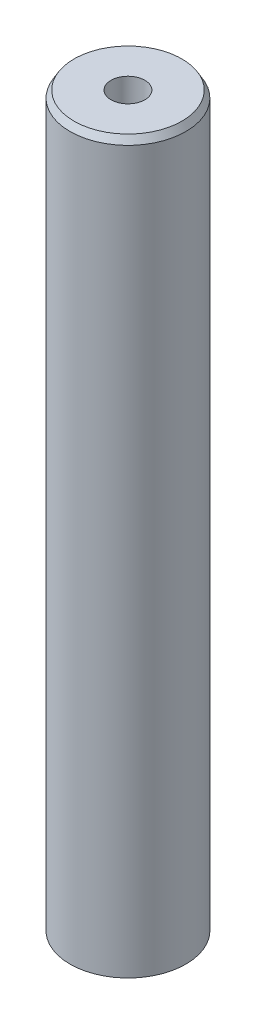
ISO-10303-21;
HEADER;
FILE_DESCRIPTION(('STEP AP214'),'2;1');
FILE_NAME('part.step','',(''),(''),'','','');
FILE_SCHEMA(('AUTOMOTIVE_DESIGN { 1 0 10303 214 1 1 1 1 }'));
ENDSEC;
DATA;
#1=APPLICATION_CONTEXT('core data for automotive mechanical design processes');
#2=APPLICATION_PROTOCOL_DEFINITION('international standard','automotive_design',2000,#1);
#3=PRODUCT_CONTEXT('',#1,'mechanical');
#4=PRODUCT('Part','Part','',(#3));
#5=PRODUCT_RELATED_PRODUCT_CATEGORY('part','',(#4));
#6=PRODUCT_DEFINITION_FORMATION('','',#4);
#7=PRODUCT_DEFINITION_CONTEXT('part definition',#1,'design');
#8=PRODUCT_DEFINITION('design','',#6,#7);
#9=PRODUCT_DEFINITION_SHAPE('','',#8);
#10=(LENGTH_UNIT() NAMED_UNIT(*) SI_UNIT(.MILLI.,.METRE.));
#11=(NAMED_UNIT(*) PLANE_ANGLE_UNIT() SI_UNIT($,.RADIAN.));
#12=(NAMED_UNIT(*) SI_UNIT($,.STERADIAN.) SOLID_ANGLE_UNIT());
#13=UNCERTAINTY_MEASURE_WITH_UNIT(LENGTH_MEASURE(1.E-05),#10,'distance_accuracy_value','');
#14=(GEOMETRIC_REPRESENTATION_CONTEXT(3) GLOBAL_UNCERTAINTY_ASSIGNED_CONTEXT((#13)) GLOBAL_UNIT_ASSIGNED_CONTEXT((#10,
#11,#12)) REPRESENTATION_CONTEXT('',''));
#15=CARTESIAN_POINT('',(0.,0.,0.));
#16=DIRECTION('',(0.,0.,1.));
#17=DIRECTION('',(1.,0.,0.));
#18=AXIS2_PLACEMENT_3D('',#15,#16,#17);
#19=CARTESIAN_POINT('',(0.,600.,0.));
#20=DIRECTION('',(0.,-1.,0.));
#21=DIRECTION('',(0.,0.,-1.));
#22=AXIS2_PLACEMENT_3D('',#19,#20,#21);
#23=CYLINDRICAL_SURFACE('',#22,47.5);
#24=CARTESIAN_POINT('',(0.,594.307646431165,0.));
#25=DIRECTION('',(0.,1.,0.));
#26=DIRECTION('',(0.,0.,1.));
#27=AXIS2_PLACEMENT_3D('',#24,#25,#26);
#28=CIRCLE('',#27,47.5);
#29=CARTESIAN_POINT('',(0.,594.307646431165,47.5));
#30=VERTEX_POINT('',#29);
#31=EDGE_CURVE('E50',#30,#30,#28,.F.);
#32=ORIENTED_EDGE('',*,*,#31,.T.);
#33=EDGE_LOOP('',(#32));
#34=FACE_BOUND('',#33,.T.);
#35=CARTESIAN_POINT('',(0.,3.28648186528946,0.));
#36=DIRECTION('',(0.,1.,0.));
#37=DIRECTION('',(0.,0.,1.));
#38=AXIS2_PLACEMENT_3D('',#35,#36,#37);
#39=CIRCLE('',#38,47.5);
#40=CARTESIAN_POINT('',(0.,3.28648186528946,47.5));
#41=VERTEX_POINT('',#40);
#42=EDGE_CURVE('E51',#41,#41,#39,.T.);
#43=ORIENTED_EDGE('',*,*,#42,.T.);
#44=EDGE_LOOP('',(#43));
#45=FACE_BOUND('',#44,.T.);
#46=ADVANCED_FACE('F39',(#34,#45),#23,.T.);
#47=CARTESIAN_POINT('',(0.,600.,0.));
#48=DIRECTION('',(0.,1.,0.));
#49=DIRECTION('',(0.,0.,1.));
#50=AXIS2_PLACEMENT_3D('',#47,#48,#49);
#51=PLANE('',#50);
#52=CARTESIAN_POINT('',(0.,600.,0.));
#53=DIRECTION('',(0.,1.,0.));
#54=DIRECTION('',(0.,0.,1.));
#55=AXIS2_PLACEMENT_3D('',#52,#53,#54);
#56=CIRCLE('',#55,44.2135181347105);
#57=CARTESIAN_POINT('',(0.,600.,44.2135181347105));
#58=VERTEX_POINT('',#57);
#59=EDGE_CURVE('E54',#58,#58,#56,.T.);
#60=ORIENTED_EDGE('',*,*,#59,.T.);
#61=EDGE_LOOP('',(#60));
#62=FACE_BOUND('',#61,.T.);
#63=CARTESIAN_POINT('',(0.,600.,0.));
#64=DIRECTION('',(0.,1.,0.));
#65=DIRECTION('',(0.,0.,1.));
#66=AXIS2_PLACEMENT_3D('',#63,#64,#65);
#67=CIRCLE('',#66,13.877057119281);
#68=CARTESIAN_POINT('',(0.,600.,13.877057119281));
#69=VERTEX_POINT('',#68);
#70=EDGE_CURVE('E58',#69,#69,#67,.T.);
#71=ORIENTED_EDGE('',*,*,#70,.F.);
#72=EDGE_LOOP('',(#71));
#73=FACE_BOUND('',#72,.T.);
#74=ADVANCED_FACE('F69',(#62,#73),#51,.T.);
#75=CARTESIAN_POINT('',(0.,0.,0.));
#76=DIRECTION('',(0.,1.,0.));
#77=DIRECTION('',(0.,0.,1.));
#78=AXIS2_PLACEMENT_3D('',#75,#76,#77);
#79=PLANE('',#78);
#80=CARTESIAN_POINT('',(0.,0.,0.));
#81=DIRECTION('',(0.,1.,0.));
#82=DIRECTION('',(0.,0.,1.));
#83=AXIS2_PLACEMENT_3D('',#80,#81,#82);
#84=CIRCLE('',#83,41.8076464311649);
#85=CARTESIAN_POINT('',(0.,0.,41.8076464311649));
#86=VERTEX_POINT('',#85);
#87=EDGE_CURVE('E10',#86,#86,#84,.F.);
#88=ORIENTED_EDGE('',*,*,#87,.T.);
#89=EDGE_LOOP('',(#88));
#90=FACE_BOUND('',#89,.T.);
#91=CARTESIAN_POINT('',(0.,0.,0.));
#92=DIRECTION('',(0.,1.,0.));
#93=DIRECTION('',(0.,0.,1.));
#94=AXIS2_PLACEMENT_3D('',#91,#92,#93);
#95=CIRCLE('',#94,13.877057119281);
#96=CARTESIAN_POINT('',(0.,0.,13.877057119281));
#97=VERTEX_POINT('',#96);
#98=EDGE_CURVE('E63',#97,#97,#95,.T.);
#99=ORIENTED_EDGE('',*,*,#98,.T.);
#100=EDGE_LOOP('',(#99));
#101=FACE_BOUND('',#100,.T.);
#102=ADVANCED_FACE('F75',(#90,#101),#79,.F.);
#103=CARTESIAN_POINT('',(0.,600.,0.));
#104=DIRECTION('',(0.,-1.,0.));
#105=DIRECTION('',(0.,0.,-1.));
#106=AXIS2_PLACEMENT_3D('',#103,#104,#105);
#107=CYLINDRICAL_SURFACE('',#106,13.877057119281);
#108=ORIENTED_EDGE('',*,*,#70,.T.);
#109=EDGE_LOOP('',(#108));
#110=FACE_BOUND('',#109,.T.);
#111=ORIENTED_EDGE('',*,*,#98,.F.);
#112=EDGE_LOOP('',(#111));
#113=FACE_BOUND('',#112,.T.);
#114=ADVANCED_FACE('F70',(#110,#113),#107,.F.);
#115=CARTESIAN_POINT('',(0.,600.,0.));
#116=DIRECTION('',(0.,-1.,0.));
#117=DIRECTION('',(0.,0.,-1.));
#118=AXIS2_PLACEMENT_3D('',#115,#116,#117);
#119=CONICAL_SURFACE('',#118,44.2135181347105,0.523598775598298);
#120=ORIENTED_EDGE('',*,*,#31,.F.);
#121=EDGE_LOOP('',(#120));
#122=FACE_BOUND('',#121,.T.);
#123=ORIENTED_EDGE('',*,*,#59,.F.);
#124=EDGE_LOOP('',(#123));
#125=FACE_BOUND('',#124,.T.);
#126=ADVANCED_FACE('F81',(#122,#125),#119,.T.);
#127=CARTESIAN_POINT('',(0.,3.28648186528946,0.));
#128=DIRECTION('',(0.,1.,0.));
#129=DIRECTION('',(0.,0.,1.));
#130=AXIS2_PLACEMENT_3D('',#127,#128,#129);
#131=CONICAL_SURFACE('',#130,47.5,1.0471975511966);
#132=ORIENTED_EDGE('',*,*,#87,.F.);
#133=EDGE_LOOP('',(#132));
#134=FACE_BOUND('',#133,.T.);
#135=ORIENTED_EDGE('',*,*,#42,.F.);
#136=EDGE_LOOP('',(#135));
#137=FACE_BOUND('',#136,.T.);
#138=ADVANCED_FACE('F45',(#134,#137),#131,.T.);
#139=CLOSED_SHELL('',(#46,#74,#102,#114,#126,#138));
#140=MANIFOLD_SOLID_BREP('B2',#139);
#141=ADVANCED_BREP_SHAPE_REPRESENTATION('',(#18,#140),#14);
#142=SHAPE_DEFINITION_REPRESENTATION(#9,#141);
ENDSEC;
END-ISO-10303-21;
